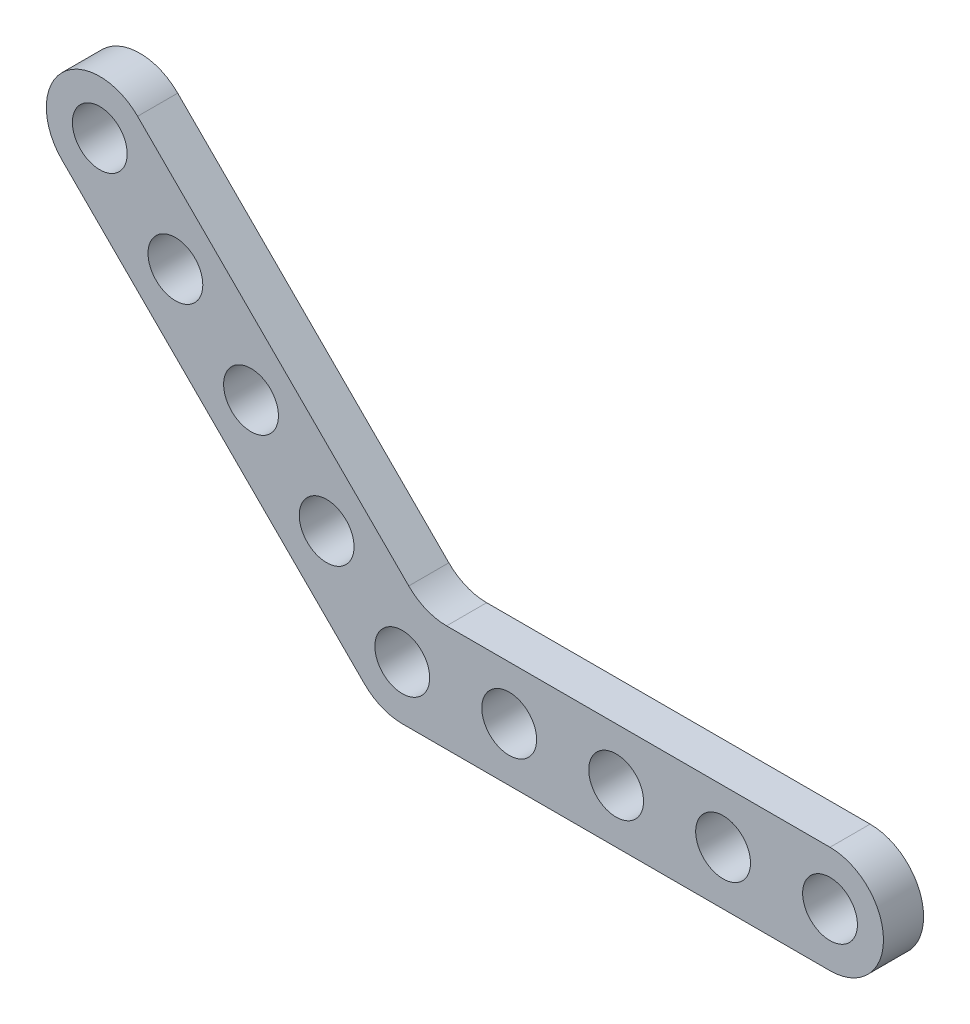
ISO-10303-21;
HEADER;
FILE_DESCRIPTION(('STEP AP214'),'2;1');
FILE_NAME('part.step','',(''),(''),'','','');
FILE_SCHEMA(('AUTOMOTIVE_DESIGN { 1 0 10303 214 1 1 1 1 }'));
ENDSEC;
DATA;
#1=APPLICATION_CONTEXT('core data for automotive mechanical design processes');
#2=APPLICATION_PROTOCOL_DEFINITION('international standard','automotive_design',2000,#1);
#3=PRODUCT_CONTEXT('',#1,'mechanical');
#4=PRODUCT('Part','Part','',(#3));
#5=PRODUCT_RELATED_PRODUCT_CATEGORY('part','',(#4));
#6=PRODUCT_DEFINITION_FORMATION('','',#4);
#7=PRODUCT_DEFINITION_CONTEXT('part definition',#1,'design');
#8=PRODUCT_DEFINITION('design','',#6,#7);
#9=PRODUCT_DEFINITION_SHAPE('','',#8);
#10=(LENGTH_UNIT() NAMED_UNIT(*) SI_UNIT(.MILLI.,.METRE.));
#11=(NAMED_UNIT(*) PLANE_ANGLE_UNIT() SI_UNIT($,.RADIAN.));
#12=(NAMED_UNIT(*) SI_UNIT($,.STERADIAN.) SOLID_ANGLE_UNIT());
#13=UNCERTAINTY_MEASURE_WITH_UNIT(LENGTH_MEASURE(1.E-05),#10,'distance_accuracy_value','');
#14=(GEOMETRIC_REPRESENTATION_CONTEXT(3) GLOBAL_UNCERTAINTY_ASSIGNED_CONTEXT((#13)) GLOBAL_UNIT_ASSIGNED_CONTEXT((#10,
#11,#12)) REPRESENTATION_CONTEXT('',''));
#15=CARTESIAN_POINT('',(0.,0.,0.));
#16=DIRECTION('',(0.,0.,1.));
#17=DIRECTION('',(1.,0.,0.));
#18=AXIS2_PLACEMENT_3D('',#15,#16,#17);
#19=CARTESIAN_POINT('',(3.31370849898474,8.,3.));
#20=DIRECTION('',(0.,0.,-1.));
#21=DIRECTION('',(-1.,0.,0.));
#22=AXIS2_PLACEMENT_3D('',#19,#20,#21);
#23=CYLINDRICAL_SURFACE('',#22,4.);
#24=CARTESIAN_POINT('',(3.31370849898474,8.,0.));
#25=DIRECTION('',(0.,0.,-1.));
#26=DIRECTION('',(-1.,0.,0.));
#27=AXIS2_PLACEMENT_3D('',#24,#25,#26);
#28=CIRCLE('',#27,4.);
#29=CARTESIAN_POINT('',(3.31370849898473,4.,0.));
#30=VERTEX_POINT('',#29);
#31=CARTESIAN_POINT('',(0.485281374238559,5.1715728752538,0.));
#32=VERTEX_POINT('',#31);
#33=EDGE_CURVE('E129',#30,#32,#28,.T.);
#34=ORIENTED_EDGE('',*,*,#33,.T.);
#35=DIRECTION('',(0.,0.,-1.));
#36=VECTOR('',#35,1.);
#37=CARTESIAN_POINT('',(0.485281374238559,5.1715728752538,3.));
#38=LINE('',#37,#36);
#39=CARTESIAN_POINT('',(0.485281374238559,5.1715728752538,3.));
#40=VERTEX_POINT('',#39);
#41=EDGE_CURVE('E11',#40,#32,#38,.T.);
#42=ORIENTED_EDGE('',*,*,#41,.F.);
#43=CARTESIAN_POINT('',(3.31370849898474,8.,3.));
#44=DIRECTION('',(0.,0.,-1.));
#45=DIRECTION('',(-1.,0.,0.));
#46=AXIS2_PLACEMENT_3D('',#43,#44,#45);
#47=CIRCLE('',#46,4.);
#48=CARTESIAN_POINT('',(3.31370849898473,4.,3.));
#49=VERTEX_POINT('',#48);
#50=EDGE_CURVE('E144',#49,#40,#47,.T.);
#51=ORIENTED_EDGE('',*,*,#50,.F.);
#52=DIRECTION('',(0.,0.,-1.));
#53=VECTOR('',#52,1.);
#54=CARTESIAN_POINT('',(3.31370849898473,4.,3.));
#55=LINE('',#54,#53);
#56=EDGE_CURVE('E125',#49,#30,#55,.T.);
#57=ORIENTED_EDGE('',*,*,#56,.T.);
#58=EDGE_LOOP('',(#34,#42,#51,#57));
#59=FACE_BOUND('',#58,.T.);
#60=ADVANCED_FACE('F33',(#59),#23,.F.);
#61=CARTESIAN_POINT('',(0.485281374238559,5.1715728752538,3.));
#62=DIRECTION('',(-0.707106781186544,-0.707106781186551,0.));
#63=DIRECTION('',(0.707106781186551,-0.707106781186544,0.));
#64=AXIS2_PLACEMENT_3D('',#61,#62,#63);
#65=PLANE('',#64);
#66=DIRECTION('',(-0.707106781186551,0.707106781186544,0.));
#67=VECTOR('',#66,1.);
#68=CARTESIAN_POINT('',(0.485281374238559,5.1715728752538,0.));
#69=LINE('',#68,#67);
#70=CARTESIAN_POINT('',(-19.7989898732235,25.4558441227156,0.));
#71=VERTEX_POINT('',#70);
#72=EDGE_CURVE('E132',#32,#71,#69,.T.);
#73=ORIENTED_EDGE('',*,*,#72,.T.);
#74=DIRECTION('',(0.,0.,-1.));
#75=VECTOR('',#74,1.);
#76=CARTESIAN_POINT('',(-19.7989898732235,25.4558441227156,3.));
#77=LINE('',#76,#75);
#78=CARTESIAN_POINT('',(-19.7989898732235,25.4558441227156,3.));
#79=VERTEX_POINT('',#78);
#80=EDGE_CURVE('E41',#79,#71,#77,.T.);
#81=ORIENTED_EDGE('',*,*,#80,.F.);
#82=DIRECTION('',(-0.707106781186551,0.707106781186544,0.));
#83=VECTOR('',#82,1.);
#84=CARTESIAN_POINT('',(0.485281374238559,5.1715728752538,3.));
#85=LINE('',#84,#83);
#86=EDGE_CURVE('E92',#40,#79,#85,.T.);
#87=ORIENTED_EDGE('',*,*,#86,.F.);
#88=ORIENTED_EDGE('',*,*,#41,.T.);
#89=EDGE_LOOP('',(#73,#81,#87,#88));
#90=FACE_BOUND('',#89,.T.);
#91=ADVANCED_FACE('F275',(#90),#65,.F.);
#92=CARTESIAN_POINT('',(-22.6274169979696,22.6274169979694,3.));
#93=DIRECTION('',(0.,0.,-1.));
#94=DIRECTION('',(-1.,0.,0.));
#95=AXIS2_PLACEMENT_3D('',#92,#93,#94);
#96=CYLINDRICAL_SURFACE('',#95,4.);
#97=CARTESIAN_POINT('',(-22.6274169979696,22.6274169979694,0.));
#98=DIRECTION('',(0.,0.,1.));
#99=DIRECTION('',(1.,0.,0.));
#100=AXIS2_PLACEMENT_3D('',#97,#98,#99);
#101=CIRCLE('',#100,4.);
#102=CARTESIAN_POINT('',(-25.4558441227158,19.7989898732232,0.));
#103=VERTEX_POINT('',#102);
#104=EDGE_CURVE('E135',#71,#103,#101,.T.);
#105=ORIENTED_EDGE('',*,*,#104,.T.);
#106=DIRECTION('',(0.,0.,-1.));
#107=VECTOR('',#106,1.);
#108=CARTESIAN_POINT('',(-25.4558441227158,19.7989898732232,3.));
#109=LINE('',#108,#107);
#110=CARTESIAN_POINT('',(-25.4558441227158,19.7989898732232,3.));
#111=VERTEX_POINT('',#110);
#112=EDGE_CURVE('E151',#111,#103,#109,.T.);
#113=ORIENTED_EDGE('',*,*,#112,.F.);
#114=CARTESIAN_POINT('',(-22.6274169979696,22.6274169979694,3.));
#115=DIRECTION('',(0.,0.,1.));
#116=DIRECTION('',(1.,0.,0.));
#117=AXIS2_PLACEMENT_3D('',#114,#115,#116);
#118=CIRCLE('',#117,4.);
#119=EDGE_CURVE('E159',#79,#111,#118,.T.);
#120=ORIENTED_EDGE('',*,*,#119,.F.);
#121=ORIENTED_EDGE('',*,*,#80,.T.);
#122=EDGE_LOOP('',(#105,#113,#120,#121));
#123=FACE_BOUND('',#122,.T.);
#124=ADVANCED_FACE('F157',(#123),#96,.T.);
#125=CARTESIAN_POINT('',(-2.82842712474618,-2.82842712474621,3.));
#126=DIRECTION('',(0.707106781186544,0.707106781186551,0.));
#127=DIRECTION('',(-0.707106781186551,0.707106781186544,0.));
#128=AXIS2_PLACEMENT_3D('',#125,#126,#127);
#129=PLANE('',#128);
#130=DIRECTION('',(0.707106781186551,-0.707106781186544,0.));
#131=VECTOR('',#130,1.);
#132=CARTESIAN_POINT('',(-2.82842712474618,-2.82842712474621,0.));
#133=LINE('',#132,#131);
#134=CARTESIAN_POINT('',(-2.82842712474624,-2.82842712474627,0.));
#135=VERTEX_POINT('',#134);
#136=EDGE_CURVE('E137',#103,#135,#133,.T.);
#137=ORIENTED_EDGE('',*,*,#136,.T.);
#138=DIRECTION('',(0.,0.,-1.));
#139=VECTOR('',#138,1.);
#140=CARTESIAN_POINT('',(-2.82842712474624,-2.82842712474627,3.));
#141=LINE('',#140,#139);
#142=CARTESIAN_POINT('',(-2.82842712474624,-2.82842712474627,3.));
#143=VERTEX_POINT('',#142);
#144=EDGE_CURVE('E148',#143,#135,#141,.T.);
#145=ORIENTED_EDGE('',*,*,#144,.F.);
#146=DIRECTION('',(0.707106781186551,-0.707106781186544,0.));
#147=VECTOR('',#146,1.);
#148=CARTESIAN_POINT('',(-2.82842712474618,-2.82842712474621,3.));
#149=LINE('',#148,#147);
#150=EDGE_CURVE('E171',#111,#143,#149,.T.);
#151=ORIENTED_EDGE('',*,*,#150,.F.);
#152=ORIENTED_EDGE('',*,*,#112,.T.);
#153=EDGE_LOOP('',(#137,#145,#151,#152));
#154=FACE_BOUND('',#153,.T.);
#155=ADVANCED_FACE('F167',(#154),#129,.F.);
#156=CARTESIAN_POINT('',(0.,0.,3.));
#157=DIRECTION('',(0.,0.,-1.));
#158=DIRECTION('',(-1.,0.,0.));
#159=AXIS2_PLACEMENT_3D('',#156,#157,#158);
#160=CYLINDRICAL_SURFACE('',#159,4.00000000000009);
#161=CARTESIAN_POINT('',(0.,0.,0.));
#162=DIRECTION('',(0.,0.,1.));
#163=DIRECTION('',(1.,0.,0.));
#164=AXIS2_PLACEMENT_3D('',#161,#162,#163);
#165=CIRCLE('',#164,4.00000000000009);
#166=CARTESIAN_POINT('',(0.,-4.00000000000017,0.));
#167=VERTEX_POINT('',#166);
#168=EDGE_CURVE('E139',#135,#167,#165,.T.);
#169=ORIENTED_EDGE('',*,*,#168,.T.);
#170=DIRECTION('',(0.,0.,-1.));
#171=VECTOR('',#170,1.);
#172=CARTESIAN_POINT('',(0.,-4.00000000000017,3.));
#173=LINE('',#172,#171);
#174=CARTESIAN_POINT('',(0.,-4.00000000000017,3.));
#175=VERTEX_POINT('',#174);
#176=EDGE_CURVE('E120',#175,#167,#173,.T.);
#177=ORIENTED_EDGE('',*,*,#176,.F.);
#178=CARTESIAN_POINT('',(0.,0.,3.));
#179=DIRECTION('',(0.,0.,1.));
#180=DIRECTION('',(1.,0.,0.));
#181=AXIS2_PLACEMENT_3D('',#178,#179,#180);
#182=CIRCLE('',#181,4.00000000000009);
#183=EDGE_CURVE('E111',#143,#175,#182,.T.);
#184=ORIENTED_EDGE('',*,*,#183,.F.);
#185=ORIENTED_EDGE('',*,*,#144,.T.);
#186=EDGE_LOOP('',(#169,#177,#184,#185));
#187=FACE_BOUND('',#186,.T.);
#188=ADVANCED_FACE('F170',(#187),#160,.T.);
#189=CARTESIAN_POINT('',(0.,-4.00000000000017,3.));
#190=DIRECTION('',(0.,1.,0.));
#191=DIRECTION('',(-1.,0.,0.));
#192=AXIS2_PLACEMENT_3D('',#189,#190,#191);
#193=PLANE('',#192);
#194=DIRECTION('',(1.,0.,0.));
#195=VECTOR('',#194,1.);
#196=CARTESIAN_POINT('',(0.,-4.00000000000017,0.));
#197=LINE('',#196,#195);
#198=CARTESIAN_POINT('',(32.,-4.,0.));
#199=VERTEX_POINT('',#198);
#200=EDGE_CURVE('E119',#167,#199,#197,.T.);
#201=ORIENTED_EDGE('',*,*,#200,.T.);
#202=DIRECTION('',(0.,0.,-1.));
#203=VECTOR('',#202,1.);
#204=CARTESIAN_POINT('',(32.,-4.,3.));
#205=LINE('',#204,#203);
#206=CARTESIAN_POINT('',(32.,-4.,3.));
#207=VERTEX_POINT('',#206);
#208=EDGE_CURVE('E116',#207,#199,#205,.T.);
#209=ORIENTED_EDGE('',*,*,#208,.F.);
#210=DIRECTION('',(1.,0.,0.));
#211=VECTOR('',#210,1.);
#212=CARTESIAN_POINT('',(0.,-4.00000000000017,3.));
#213=LINE('',#212,#211);
#214=EDGE_CURVE('E105',#175,#207,#213,.T.);
#215=ORIENTED_EDGE('',*,*,#214,.F.);
#216=ORIENTED_EDGE('',*,*,#176,.T.);
#217=EDGE_LOOP('',(#201,#209,#215,#216));
#218=FACE_BOUND('',#217,.T.);
#219=ADVANCED_FACE('F117',(#218),#193,.F.);
#220=CARTESIAN_POINT('',(32.,0.,3.));
#221=DIRECTION('',(0.,0.,-1.));
#222=DIRECTION('',(-1.,0.,0.));
#223=AXIS2_PLACEMENT_3D('',#220,#221,#222);
#224=CYLINDRICAL_SURFACE('',#223,4.);
#225=CARTESIAN_POINT('',(32.,0.,0.));
#226=DIRECTION('',(0.,0.,1.));
#227=DIRECTION('',(1.,0.,0.));
#228=AXIS2_PLACEMENT_3D('',#225,#226,#227);
#229=CIRCLE('',#228,4.);
#230=CARTESIAN_POINT('',(32.,4.,0.));
#231=VERTEX_POINT('',#230);
#232=EDGE_CURVE('E78',#199,#231,#229,.T.);
#233=ORIENTED_EDGE('',*,*,#232,.T.);
#234=DIRECTION('',(0.,0.,-1.));
#235=VECTOR('',#234,1.);
#236=CARTESIAN_POINT('',(32.,4.,3.));
#237=LINE('',#236,#235);
#238=CARTESIAN_POINT('',(32.,4.,3.));
#239=VERTEX_POINT('',#238);
#240=EDGE_CURVE('E121',#239,#231,#237,.T.);
#241=ORIENTED_EDGE('',*,*,#240,.F.);
#242=CARTESIAN_POINT('',(32.,0.,3.));
#243=DIRECTION('',(0.,0.,1.));
#244=DIRECTION('',(1.,0.,0.));
#245=AXIS2_PLACEMENT_3D('',#242,#243,#244);
#246=CIRCLE('',#245,4.);
#247=EDGE_CURVE('E109',#207,#239,#246,.T.);
#248=ORIENTED_EDGE('',*,*,#247,.F.);
#249=ORIENTED_EDGE('',*,*,#208,.T.);
#250=EDGE_LOOP('',(#233,#241,#248,#249));
#251=FACE_BOUND('',#250,.T.);
#252=ADVANCED_FACE('F123',(#251),#224,.T.);
#253=CARTESIAN_POINT('',(3.31370849898473,4.,3.));
#254=DIRECTION('',(0.,-1.,0.));
#255=DIRECTION('',(1.,0.,0.));
#256=AXIS2_PLACEMENT_3D('',#253,#254,#255);
#257=PLANE('',#256);
#258=DIRECTION('',(-1.,0.,0.));
#259=VECTOR('',#258,1.);
#260=CARTESIAN_POINT('',(3.31370849898473,4.,0.));
#261=LINE('',#260,#259);
#262=EDGE_CURVE('E84',#231,#30,#261,.T.);
#263=ORIENTED_EDGE('',*,*,#262,.T.);
#264=ORIENTED_EDGE('',*,*,#56,.F.);
#265=DIRECTION('',(-1.,0.,0.));
#266=VECTOR('',#265,1.);
#267=CARTESIAN_POINT('',(3.31370849898473,4.,3.));
#268=LINE('',#267,#266);
#269=EDGE_CURVE('E49',#239,#49,#268,.T.);
#270=ORIENTED_EDGE('',*,*,#269,.F.);
#271=ORIENTED_EDGE('',*,*,#240,.T.);
#272=EDGE_LOOP('',(#263,#264,#270,#271));
#273=FACE_BOUND('',#272,.T.);
#274=ADVANCED_FACE('F242',(#273),#257,.F.);
#275=CARTESIAN_POINT('',(3.31370849898474,8.,3.));
#276=DIRECTION('',(0.,0.,-1.));
#277=DIRECTION('',(-1.,0.,0.));
#278=AXIS2_PLACEMENT_3D('',#275,#276,#277);
#279=PLANE('',#278);
#280=CARTESIAN_POINT('',(16.,0.,3.));
#281=DIRECTION('',(0.,0.,1.));
#282=DIRECTION('',(1.,0.,0.));
#283=AXIS2_PLACEMENT_3D('',#280,#281,#282);
#284=CIRCLE('',#283,2.04999999999999);
#285=CARTESIAN_POINT('',(18.05,0.,3.));
#286=VERTEX_POINT('',#285);
#287=EDGE_CURVE('E225',#286,#286,#284,.T.);
#288=ORIENTED_EDGE('',*,*,#287,.F.);
#289=EDGE_LOOP('',(#288));
#290=FACE_BOUND('',#289,.T.);
#291=CARTESIAN_POINT('',(8.,0.,3.));
#292=DIRECTION('',(0.,0.,1.));
#293=DIRECTION('',(1.,0.,0.));
#294=AXIS2_PLACEMENT_3D('',#291,#292,#293);
#295=CIRCLE('',#294,2.04999999999999);
#296=CARTESIAN_POINT('',(10.05,0.,3.));
#297=VERTEX_POINT('',#296);
#298=EDGE_CURVE('E219',#297,#297,#295,.T.);
#299=ORIENTED_EDGE('',*,*,#298,.F.);
#300=EDGE_LOOP('',(#299));
#301=FACE_BOUND('',#300,.T.);
#302=CARTESIAN_POINT('',(24.,0.,3.));
#303=DIRECTION('',(0.,0.,1.));
#304=DIRECTION('',(1.,0.,0.));
#305=AXIS2_PLACEMENT_3D('',#302,#303,#304);
#306=CIRCLE('',#305,2.04999999999999);
#307=CARTESIAN_POINT('',(26.05,0.,3.));
#308=VERTEX_POINT('',#307);
#309=EDGE_CURVE('E213',#308,#308,#306,.T.);
#310=ORIENTED_EDGE('',*,*,#309,.F.);
#311=EDGE_LOOP('',(#310));
#312=FACE_BOUND('',#311,.T.);
#313=CARTESIAN_POINT('',(32.,0.,3.));
#314=DIRECTION('',(0.,0.,1.));
#315=DIRECTION('',(1.,0.,0.));
#316=AXIS2_PLACEMENT_3D('',#313,#314,#315);
#317=CIRCLE('',#316,2.04999999999999);
#318=CARTESIAN_POINT('',(34.05,0.,3.));
#319=VERTEX_POINT('',#318);
#320=EDGE_CURVE('E207',#319,#319,#317,.T.);
#321=ORIENTED_EDGE('',*,*,#320,.F.);
#322=EDGE_LOOP('',(#321));
#323=FACE_BOUND('',#322,.T.);
#324=CARTESIAN_POINT('',(-11.3137084989848,11.3137084989847,3.));
#325=DIRECTION('',(0.,0.,1.));
#326=DIRECTION('',(1.,0.,0.));
#327=AXIS2_PLACEMENT_3D('',#324,#325,#326);
#328=CIRCLE('',#327,2.05000000000028);
#329=CARTESIAN_POINT('',(-9.26370849898454,11.3137084989847,3.));
#330=VERTEX_POINT('',#329);
#331=EDGE_CURVE('E202',#330,#330,#328,.T.);
#332=ORIENTED_EDGE('',*,*,#331,.F.);
#333=EDGE_LOOP('',(#332));
#334=FACE_BOUND('',#333,.T.);
#335=CARTESIAN_POINT('',(-5.65685424949241,5.65685424949235,3.));
#336=DIRECTION('',(0.,0.,1.));
#337=DIRECTION('',(1.,0.,0.));
#338=AXIS2_PLACEMENT_3D('',#335,#336,#337);
#339=CIRCLE('',#338,2.05000000000028);
#340=CARTESIAN_POINT('',(-3.60685424949213,5.65685424949235,3.));
#341=VERTEX_POINT('',#340);
#342=EDGE_CURVE('E196',#341,#341,#339,.T.);
#343=ORIENTED_EDGE('',*,*,#342,.F.);
#344=EDGE_LOOP('',(#343));
#345=FACE_BOUND('',#344,.T.);
#346=CARTESIAN_POINT('',(0.,0.,3.));
#347=DIRECTION('',(0.,0.,1.));
#348=DIRECTION('',(1.,0.,0.));
#349=AXIS2_PLACEMENT_3D('',#346,#347,#348);
#350=CIRCLE('',#349,2.05000000000028);
#351=CARTESIAN_POINT('',(2.05000000000028,0.,3.));
#352=VERTEX_POINT('',#351);
#353=EDGE_CURVE('E189',#352,#352,#350,.T.);
#354=ORIENTED_EDGE('',*,*,#353,.F.);
#355=EDGE_LOOP('',(#354));
#356=FACE_BOUND('',#355,.T.);
#357=CARTESIAN_POINT('',(-16.9705627484772,16.970562748477,3.));
#358=DIRECTION('',(0.,0.,1.));
#359=DIRECTION('',(1.,0.,0.));
#360=AXIS2_PLACEMENT_3D('',#357,#358,#359);
#361=CIRCLE('',#360,2.05000000000028);
#362=CARTESIAN_POINT('',(-14.920562748477,16.970562748477,3.));
#363=VERTEX_POINT('',#362);
#364=EDGE_CURVE('E183',#363,#363,#361,.T.);
#365=ORIENTED_EDGE('',*,*,#364,.F.);
#366=EDGE_LOOP('',(#365));
#367=FACE_BOUND('',#366,.T.);
#368=CARTESIAN_POINT('',(-22.6274169979697,22.6274169979694,3.));
#369=DIRECTION('',(0.,0.,1.));
#370=DIRECTION('',(1.,0.,0.));
#371=AXIS2_PLACEMENT_3D('',#368,#369,#370);
#372=CIRCLE('',#371,2.05000000000028);
#373=CARTESIAN_POINT('',(-20.5774169979694,22.6274169979694,3.));
#374=VERTEX_POINT('',#373);
#375=EDGE_CURVE('E177',#374,#374,#372,.T.);
#376=ORIENTED_EDGE('',*,*,#375,.F.);
#377=EDGE_LOOP('',(#376));
#378=FACE_BOUND('',#377,.T.);
#379=ORIENTED_EDGE('',*,*,#50,.T.);
#380=ORIENTED_EDGE('',*,*,#86,.T.);
#381=ORIENTED_EDGE('',*,*,#119,.T.);
#382=ORIENTED_EDGE('',*,*,#150,.T.);
#383=ORIENTED_EDGE('',*,*,#183,.T.);
#384=ORIENTED_EDGE('',*,*,#214,.T.);
#385=ORIENTED_EDGE('',*,*,#247,.T.);
#386=ORIENTED_EDGE('',*,*,#269,.T.);
#387=EDGE_LOOP('',(#379,#380,#381,#382,#383,#384,#385,#386));
#388=FACE_BOUND('',#387,.T.);
#389=ADVANCED_FACE('F107',(#290,#301,#312,#323,#334,#345,#356,#367,#378,#388),#279,.F.);
#390=CARTESIAN_POINT('',(3.31370849898474,8.,0.));
#391=DIRECTION('',(0.,0.,-1.));
#392=DIRECTION('',(-1.,0.,0.));
#393=AXIS2_PLACEMENT_3D('',#390,#391,#392);
#394=PLANE('',#393);
#395=CARTESIAN_POINT('',(16.,0.,0.));
#396=DIRECTION('',(0.,0.,1.));
#397=DIRECTION('',(1.,0.,0.));
#398=AXIS2_PLACEMENT_3D('',#395,#396,#397);
#399=CIRCLE('',#398,2.04999999999999);
#400=CARTESIAN_POINT('',(18.05,0.,0.));
#401=VERTEX_POINT('',#400);
#402=EDGE_CURVE('E216',#401,#401,#399,.T.);
#403=ORIENTED_EDGE('',*,*,#402,.T.);
#404=EDGE_LOOP('',(#403));
#405=FACE_BOUND('',#404,.T.);
#406=CARTESIAN_POINT('',(8.,0.,0.));
#407=DIRECTION('',(0.,0.,1.));
#408=DIRECTION('',(1.,0.,0.));
#409=AXIS2_PLACEMENT_3D('',#406,#407,#408);
#410=CIRCLE('',#409,2.04999999999999);
#411=CARTESIAN_POINT('',(10.05,0.,0.));
#412=VERTEX_POINT('',#411);
#413=EDGE_CURVE('E222',#412,#412,#410,.T.);
#414=ORIENTED_EDGE('',*,*,#413,.T.);
#415=EDGE_LOOP('',(#414));
#416=FACE_BOUND('',#415,.T.);
#417=CARTESIAN_POINT('',(24.,0.,0.));
#418=DIRECTION('',(0.,0.,1.));
#419=DIRECTION('',(1.,0.,0.));
#420=AXIS2_PLACEMENT_3D('',#417,#418,#419);
#421=CIRCLE('',#420,2.04999999999999);
#422=CARTESIAN_POINT('',(26.05,0.,0.));
#423=VERTEX_POINT('',#422);
#424=EDGE_CURVE('E210',#423,#423,#421,.T.);
#425=ORIENTED_EDGE('',*,*,#424,.T.);
#426=EDGE_LOOP('',(#425));
#427=FACE_BOUND('',#426,.T.);
#428=CARTESIAN_POINT('',(32.,0.,0.));
#429=DIRECTION('',(0.,0.,1.));
#430=DIRECTION('',(1.,0.,0.));
#431=AXIS2_PLACEMENT_3D('',#428,#429,#430);
#432=CIRCLE('',#431,2.04999999999999);
#433=CARTESIAN_POINT('',(34.05,0.,0.));
#434=VERTEX_POINT('',#433);
#435=EDGE_CURVE('E193',#434,#434,#432,.T.);
#436=ORIENTED_EDGE('',*,*,#435,.T.);
#437=EDGE_LOOP('',(#436));
#438=FACE_BOUND('',#437,.T.);
#439=CARTESIAN_POINT('',(-11.3137084989848,11.3137084989847,0.));
#440=DIRECTION('',(0.,0.,1.));
#441=DIRECTION('',(1.,0.,0.));
#442=AXIS2_PLACEMENT_3D('',#439,#440,#441);
#443=CIRCLE('',#442,2.05000000000028);
#444=CARTESIAN_POINT('',(-9.26370849898454,11.3137084989847,0.));
#445=VERTEX_POINT('',#444);
#446=EDGE_CURVE('E186',#445,#445,#443,.T.);
#447=ORIENTED_EDGE('',*,*,#446,.T.);
#448=EDGE_LOOP('',(#447));
#449=FACE_BOUND('',#448,.T.);
#450=CARTESIAN_POINT('',(-5.65685424949241,5.65685424949235,0.));
#451=DIRECTION('',(0.,0.,1.));
#452=DIRECTION('',(1.,0.,0.));
#453=AXIS2_PLACEMENT_3D('',#450,#451,#452);
#454=CIRCLE('',#453,2.05000000000028);
#455=CARTESIAN_POINT('',(-3.60685424949213,5.65685424949235,0.));
#456=VERTEX_POINT('',#455);
#457=EDGE_CURVE('E199',#456,#456,#454,.T.);
#458=ORIENTED_EDGE('',*,*,#457,.T.);
#459=EDGE_LOOP('',(#458));
#460=FACE_BOUND('',#459,.T.);
#461=CARTESIAN_POINT('',(0.,0.,0.));
#462=DIRECTION('',(0.,0.,1.));
#463=DIRECTION('',(1.,0.,0.));
#464=AXIS2_PLACEMENT_3D('',#461,#462,#463);
#465=CIRCLE('',#464,2.05000000000028);
#466=CARTESIAN_POINT('',(2.05000000000028,0.,0.));
#467=VERTEX_POINT('',#466);
#468=EDGE_CURVE('E192',#467,#467,#465,.T.);
#469=ORIENTED_EDGE('',*,*,#468,.T.);
#470=EDGE_LOOP('',(#469));
#471=FACE_BOUND('',#470,.T.);
#472=CARTESIAN_POINT('',(-16.9705627484772,16.970562748477,0.));
#473=DIRECTION('',(0.,0.,1.));
#474=DIRECTION('',(1.,0.,0.));
#475=AXIS2_PLACEMENT_3D('',#472,#473,#474);
#476=CIRCLE('',#475,2.05000000000028);
#477=CARTESIAN_POINT('',(-14.920562748477,16.970562748477,0.));
#478=VERTEX_POINT('',#477);
#479=EDGE_CURVE('E180',#478,#478,#476,.T.);
#480=ORIENTED_EDGE('',*,*,#479,.T.);
#481=EDGE_LOOP('',(#480));
#482=FACE_BOUND('',#481,.T.);
#483=CARTESIAN_POINT('',(-22.6274169979697,22.6274169979694,0.));
#484=DIRECTION('',(0.,0.,1.));
#485=DIRECTION('',(1.,0.,0.));
#486=AXIS2_PLACEMENT_3D('',#483,#484,#485);
#487=CIRCLE('',#486,2.05000000000028);
#488=CARTESIAN_POINT('',(-20.5774169979694,22.6274169979694,0.));
#489=VERTEX_POINT('',#488);
#490=EDGE_CURVE('E133',#489,#489,#487,.T.);
#491=ORIENTED_EDGE('',*,*,#490,.T.);
#492=EDGE_LOOP('',(#491));
#493=FACE_BOUND('',#492,.T.);
#494=ORIENTED_EDGE('',*,*,#33,.F.);
#495=ORIENTED_EDGE('',*,*,#262,.F.);
#496=ORIENTED_EDGE('',*,*,#232,.F.);
#497=ORIENTED_EDGE('',*,*,#200,.F.);
#498=ORIENTED_EDGE('',*,*,#168,.F.);
#499=ORIENTED_EDGE('',*,*,#136,.F.);
#500=ORIENTED_EDGE('',*,*,#104,.F.);
#501=ORIENTED_EDGE('',*,*,#72,.F.);
#502=EDGE_LOOP('',(#494,#495,#496,#497,#498,#499,#500,#501));
#503=FACE_BOUND('',#502,.T.);
#504=ADVANCED_FACE('F163',(#405,#416,#427,#438,#449,#460,#471,#482,#493,#503),#394,.T.);
#505=CARTESIAN_POINT('',(-22.6274169979697,22.6274169979694,0.));
#506=DIRECTION('',(0.,0.,1.));
#507=DIRECTION('',(1.,0.,0.));
#508=AXIS2_PLACEMENT_3D('',#505,#506,#507);
#509=CYLINDRICAL_SURFACE('',#508,2.05000000000028);
#510=ORIENTED_EDGE('',*,*,#490,.F.);
#511=EDGE_LOOP('',(#510));
#512=FACE_BOUND('',#511,.T.);
#513=ORIENTED_EDGE('',*,*,#375,.T.);
#514=EDGE_LOOP('',(#513));
#515=FACE_BOUND('',#514,.T.);
#516=ADVANCED_FACE('F260',(#512,#515),#509,.F.);
#517=CARTESIAN_POINT('',(-16.9705627484772,16.970562748477,0.));
#518=DIRECTION('',(0.,0.,1.));
#519=DIRECTION('',(1.,0.,0.));
#520=AXIS2_PLACEMENT_3D('',#517,#518,#519);
#521=CYLINDRICAL_SURFACE('',#520,2.05000000000028);
#522=ORIENTED_EDGE('',*,*,#479,.F.);
#523=EDGE_LOOP('',(#522));
#524=FACE_BOUND('',#523,.T.);
#525=ORIENTED_EDGE('',*,*,#364,.T.);
#526=EDGE_LOOP('',(#525));
#527=FACE_BOUND('',#526,.T.);
#528=ADVANCED_FACE('F262',(#524,#527),#521,.F.);
#529=CARTESIAN_POINT('',(0.,0.,0.));
#530=DIRECTION('',(0.,0.,1.));
#531=DIRECTION('',(1.,0.,0.));
#532=AXIS2_PLACEMENT_3D('',#529,#530,#531);
#533=CYLINDRICAL_SURFACE('',#532,2.05000000000028);
#534=ORIENTED_EDGE('',*,*,#468,.F.);
#535=EDGE_LOOP('',(#534));
#536=FACE_BOUND('',#535,.T.);
#537=ORIENTED_EDGE('',*,*,#353,.T.);
#538=EDGE_LOOP('',(#537));
#539=FACE_BOUND('',#538,.T.);
#540=ADVANCED_FACE('F269',(#536,#539),#533,.F.);
#541=CARTESIAN_POINT('',(-5.65685424949241,5.65685424949235,0.));
#542=DIRECTION('',(0.,0.,1.));
#543=DIRECTION('',(1.,0.,0.));
#544=AXIS2_PLACEMENT_3D('',#541,#542,#543);
#545=CYLINDRICAL_SURFACE('',#544,2.05000000000028);
#546=ORIENTED_EDGE('',*,*,#457,.F.);
#547=EDGE_LOOP('',(#546));
#548=FACE_BOUND('',#547,.T.);
#549=ORIENTED_EDGE('',*,*,#342,.T.);
#550=EDGE_LOOP('',(#549));
#551=FACE_BOUND('',#550,.T.);
#552=ADVANCED_FACE('F341',(#548,#551),#545,.F.);
#553=CARTESIAN_POINT('',(-11.3137084989848,11.3137084989847,0.));
#554=DIRECTION('',(0.,0.,1.));
#555=DIRECTION('',(1.,0.,0.));
#556=AXIS2_PLACEMENT_3D('',#553,#554,#555);
#557=CYLINDRICAL_SURFACE('',#556,2.05000000000028);
#558=ORIENTED_EDGE('',*,*,#446,.F.);
#559=EDGE_LOOP('',(#558));
#560=FACE_BOUND('',#559,.T.);
#561=ORIENTED_EDGE('',*,*,#331,.T.);
#562=EDGE_LOOP('',(#561));
#563=FACE_BOUND('',#562,.T.);
#564=ADVANCED_FACE('F351',(#560,#563),#557,.F.);
#565=CARTESIAN_POINT('',(32.,0.,0.));
#566=DIRECTION('',(0.,0.,1.));
#567=DIRECTION('',(1.,0.,0.));
#568=AXIS2_PLACEMENT_3D('',#565,#566,#567);
#569=CYLINDRICAL_SURFACE('',#568,2.04999999999999);
#570=ORIENTED_EDGE('',*,*,#435,.F.);
#571=EDGE_LOOP('',(#570));
#572=FACE_BOUND('',#571,.T.);
#573=ORIENTED_EDGE('',*,*,#320,.T.);
#574=EDGE_LOOP('',(#573));
#575=FACE_BOUND('',#574,.T.);
#576=ADVANCED_FACE('F361',(#572,#575),#569,.F.);
#577=CARTESIAN_POINT('',(24.,0.,0.));
#578=DIRECTION('',(0.,0.,1.));
#579=DIRECTION('',(1.,0.,0.));
#580=AXIS2_PLACEMENT_3D('',#577,#578,#579);
#581=CYLINDRICAL_SURFACE('',#580,2.04999999999999);
#582=ORIENTED_EDGE('',*,*,#424,.F.);
#583=EDGE_LOOP('',(#582));
#584=FACE_BOUND('',#583,.T.);
#585=ORIENTED_EDGE('',*,*,#309,.T.);
#586=EDGE_LOOP('',(#585));
#587=FACE_BOUND('',#586,.T.);
#588=ADVANCED_FACE('F371',(#584,#587),#581,.F.);
#589=CARTESIAN_POINT('',(8.,0.,0.));
#590=DIRECTION('',(0.,0.,1.));
#591=DIRECTION('',(1.,0.,0.));
#592=AXIS2_PLACEMENT_3D('',#589,#590,#591);
#593=CYLINDRICAL_SURFACE('',#592,2.04999999999999);
#594=ORIENTED_EDGE('',*,*,#413,.F.);
#595=EDGE_LOOP('',(#594));
#596=FACE_BOUND('',#595,.T.);
#597=ORIENTED_EDGE('',*,*,#298,.T.);
#598=EDGE_LOOP('',(#597));
#599=FACE_BOUND('',#598,.T.);
#600=ADVANCED_FACE('F236',(#596,#599),#593,.F.);
#601=CARTESIAN_POINT('',(16.,0.,0.));
#602=DIRECTION('',(0.,0.,1.));
#603=DIRECTION('',(1.,0.,0.));
#604=AXIS2_PLACEMENT_3D('',#601,#602,#603);
#605=CYLINDRICAL_SURFACE('',#604,2.04999999999999);
#606=ORIENTED_EDGE('',*,*,#402,.F.);
#607=EDGE_LOOP('',(#606));
#608=FACE_BOUND('',#607,.T.);
#609=ORIENTED_EDGE('',*,*,#287,.T.);
#610=EDGE_LOOP('',(#609));
#611=FACE_BOUND('',#610,.T.);
#612=ADVANCED_FACE('F233',(#608,#611),#605,.F.);
#613=CLOSED_SHELL('',(#60,#91,#124,#155,#188,#219,#252,#274,#389,#504,#516,#528,#540,#552,#564,
#576,#588,#600,#612));
#614=MANIFOLD_SOLID_BREP('B2',#613);
#615=ADVANCED_BREP_SHAPE_REPRESENTATION('',(#18,#614),#14);
#616=SHAPE_DEFINITION_REPRESENTATION(#9,#615);
ENDSEC;
END-ISO-10303-21;
